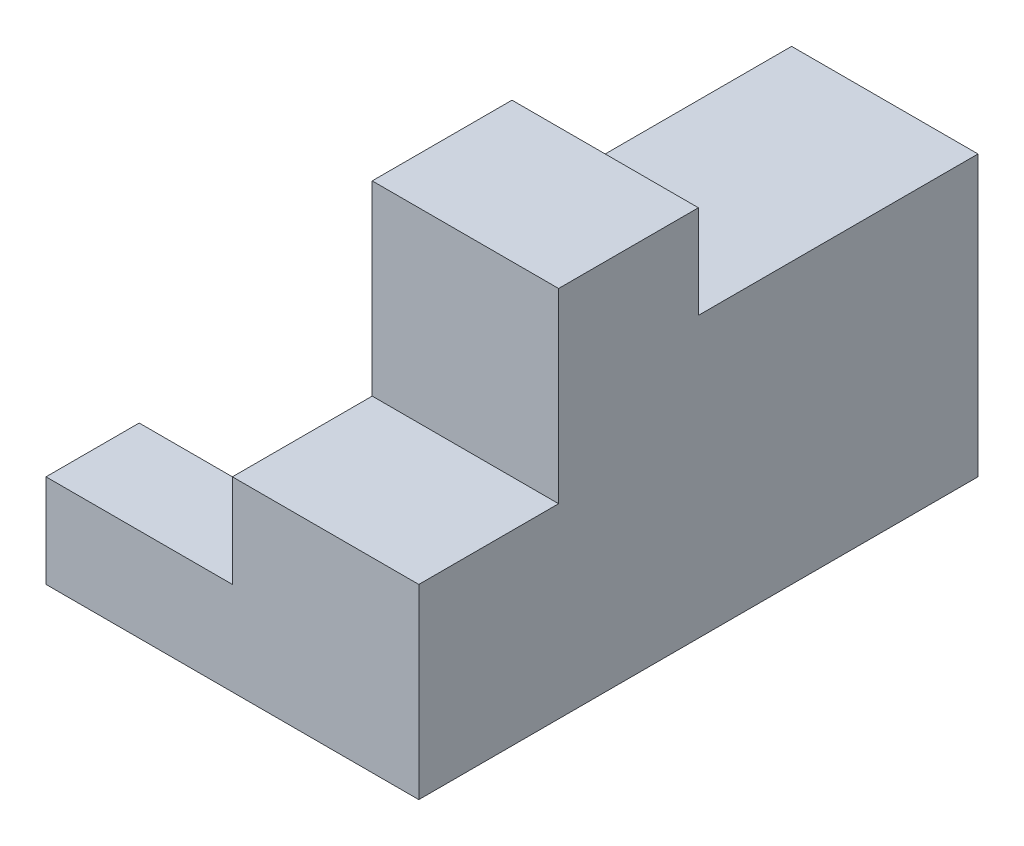
ISO-10303-21;
HEADER;
FILE_DESCRIPTION(('STEP AP214'),'2;1');
FILE_NAME('part.step','',(''),(''),'','','');
FILE_SCHEMA(('AUTOMOTIVE_DESIGN { 1 0 10303 214 1 1 1 1 }'));
ENDSEC;
DATA;
#1=APPLICATION_CONTEXT('core data for automotive mechanical design processes');
#2=APPLICATION_PROTOCOL_DEFINITION('international standard','automotive_design',2000,#1);
#3=PRODUCT_CONTEXT('',#1,'mechanical');
#4=PRODUCT('Part','Part','',(#3));
#5=PRODUCT_RELATED_PRODUCT_CATEGORY('part','',(#4));
#6=PRODUCT_DEFINITION_FORMATION('','',#4);
#7=PRODUCT_DEFINITION_CONTEXT('part definition',#1,'design');
#8=PRODUCT_DEFINITION('design','',#6,#7);
#9=PRODUCT_DEFINITION_SHAPE('','',#8);
#10=(LENGTH_UNIT() NAMED_UNIT(*) SI_UNIT(.MILLI.,.METRE.));
#11=(NAMED_UNIT(*) PLANE_ANGLE_UNIT() SI_UNIT($,.RADIAN.));
#12=(NAMED_UNIT(*) SI_UNIT($,.STERADIAN.) SOLID_ANGLE_UNIT());
#13=UNCERTAINTY_MEASURE_WITH_UNIT(LENGTH_MEASURE(1.E-05),#10,'distance_accuracy_value','');
#14=(GEOMETRIC_REPRESENTATION_CONTEXT(3) GLOBAL_UNCERTAINTY_ASSIGNED_CONTEXT((#13)) GLOBAL_UNIT_ASSIGNED_CONTEXT((#10,
#11,#12)) REPRESENTATION_CONTEXT('',''));
#15=CARTESIAN_POINT('',(0.,0.,0.));
#16=DIRECTION('',(0.,0.,1.));
#17=DIRECTION('',(1.,0.,0.));
#18=AXIS2_PLACEMENT_3D('',#15,#16,#17);
#19=CARTESIAN_POINT('',(0.,0.,60.));
#20=DIRECTION('',(0.,0.,-1.));
#21=DIRECTION('',(-1.,0.,0.));
#22=AXIS2_PLACEMENT_3D('',#19,#20,#21);
#23=PLANE('',#22);
#24=DIRECTION('',(1.,0.,0.));
#25=VECTOR('',#24,1.);
#26=CARTESIAN_POINT('',(40.,20.,60.));
#27=LINE('',#26,#25);
#28=CARTESIAN_POINT('',(20.,20.,60.));
#29=VERTEX_POINT('',#28);
#30=CARTESIAN_POINT('',(40.,20.,60.));
#31=VERTEX_POINT('',#30);
#32=EDGE_CURVE('E145',#29,#31,#27,.T.);
#33=ORIENTED_EDGE('',*,*,#32,.F.);
#34=DIRECTION('',(0.,1.,0.));
#35=VECTOR('',#34,1.);
#36=CARTESIAN_POINT('',(20.,10.,60.));
#37=LINE('',#36,#35);
#38=CARTESIAN_POINT('',(20.,10.,60.));
#39=VERTEX_POINT('',#38);
#40=EDGE_CURVE('E195',#39,#29,#37,.T.);
#41=ORIENTED_EDGE('',*,*,#40,.F.);
#42=DIRECTION('',(1.,0.,0.));
#43=VECTOR('',#42,1.);
#44=CARTESIAN_POINT('',(10.,10.,60.));
#45=LINE('',#44,#43);
#46=CARTESIAN_POINT('',(0.,10.,60.));
#47=VERTEX_POINT('',#46);
#48=EDGE_CURVE('E188',#47,#39,#45,.T.);
#49=ORIENTED_EDGE('',*,*,#48,.F.);
#50=DIRECTION('',(0.,-1.,0.));
#51=VECTOR('',#50,1.);
#52=CARTESIAN_POINT('',(0.,0.,60.));
#53=LINE('',#52,#51);
#54=CARTESIAN_POINT('',(0.,0.,60.));
#55=VERTEX_POINT('',#54);
#56=EDGE_CURVE('E224',#47,#55,#53,.T.);
#57=ORIENTED_EDGE('',*,*,#56,.T.);
#58=DIRECTION('',(1.,0.,0.));
#59=VECTOR('',#58,1.);
#60=CARTESIAN_POINT('',(0.,0.,60.));
#61=LINE('',#60,#59);
#62=CARTESIAN_POINT('',(40.,0.,60.));
#63=VERTEX_POINT('',#62);
#64=EDGE_CURVE('E226',#55,#63,#61,.T.);
#65=ORIENTED_EDGE('',*,*,#64,.T.);
#66=DIRECTION('',(0.,1.,0.));
#67=VECTOR('',#66,1.);
#68=CARTESIAN_POINT('',(40.,0.,60.));
#69=LINE('',#68,#67);
#70=EDGE_CURVE('E229',#63,#31,#69,.T.);
#71=ORIENTED_EDGE('',*,*,#70,.T.);
#72=EDGE_LOOP('',(#33,#41,#49,#57,#65,#71));
#73=FACE_BOUND('',#72,.T.);
#74=ADVANCED_FACE('F33',(#73),#23,.F.);
#75=CARTESIAN_POINT('',(0.,40.,60.));
#76=DIRECTION('',(0.,-1.,0.));
#77=DIRECTION('',(0.,0.,-1.));
#78=AXIS2_PLACEMENT_3D('',#75,#76,#77);
#79=PLANE('',#78);
#80=DIRECTION('',(0.,0.,-1.));
#81=VECTOR('',#80,1.);
#82=CARTESIAN_POINT('',(20.,40.,10.));
#83=LINE('',#82,#81);
#84=CARTESIAN_POINT('',(20.,40.,45.));
#85=VERTEX_POINT('',#84);
#86=CARTESIAN_POINT('',(20.,40.,30.));
#87=VERTEX_POINT('',#86);
#88=EDGE_CURVE('E184',#85,#87,#83,.T.);
#89=ORIENTED_EDGE('',*,*,#88,.F.);
#90=DIRECTION('',(-1.,0.,0.));
#91=VECTOR('',#90,1.);
#92=CARTESIAN_POINT('',(40.,40.,45.));
#93=LINE('',#92,#91);
#94=CARTESIAN_POINT('',(40.,40.,45.));
#95=VERTEX_POINT('',#94);
#96=EDGE_CURVE('E149',#95,#85,#93,.T.);
#97=ORIENTED_EDGE('',*,*,#96,.F.);
#98=DIRECTION('',(0.,0.,-1.));
#99=VECTOR('',#98,1.);
#100=CARTESIAN_POINT('',(40.,40.,60.));
#101=LINE('',#100,#99);
#102=CARTESIAN_POINT('',(40.,40.,30.));
#103=VERTEX_POINT('',#102);
#104=EDGE_CURVE('E154',#95,#103,#101,.T.);
#105=ORIENTED_EDGE('',*,*,#104,.T.);
#106=DIRECTION('',(1.,0.,0.));
#107=VECTOR('',#106,1.);
#108=CARTESIAN_POINT('',(40.,40.,30.));
#109=LINE('',#108,#107);
#110=EDGE_CURVE('E156',#87,#103,#109,.T.);
#111=ORIENTED_EDGE('',*,*,#110,.F.);
#112=EDGE_LOOP('',(#89,#97,#105,#111));
#113=FACE_BOUND('',#112,.T.);
#114=ADVANCED_FACE('F262',(#113),#79,.F.);
#115=CARTESIAN_POINT('',(10.,-20.,10.));
#116=DIRECTION('',(1.,0.,0.));
#117=DIRECTION('',(0.,0.,-1.));
#118=AXIS2_PLACEMENT_3D('',#115,#116,#117);
#119=PLANE('',#118);
#120=DIRECTION('',(0.,0.,1.));
#121=VECTOR('',#120,1.);
#122=CARTESIAN_POINT('',(10.,10.,10.));
#123=LINE('',#122,#121);
#124=CARTESIAN_POINT('',(10.,10.,10.));
#125=VERTEX_POINT('',#124);
#126=CARTESIAN_POINT('',(10.,10.,50.));
#127=VERTEX_POINT('',#126);
#128=EDGE_CURVE('E185',#125,#127,#123,.T.);
#129=ORIENTED_EDGE('',*,*,#128,.F.);
#130=DIRECTION('',(0.,1.,0.));
#131=VECTOR('',#130,1.);
#132=CARTESIAN_POINT('',(10.,-20.,10.));
#133=LINE('',#132,#131);
#134=CARTESIAN_POINT('',(10.,0.,10.));
#135=VERTEX_POINT('',#134);
#136=EDGE_CURVE('E200',#135,#125,#133,.T.);
#137=ORIENTED_EDGE('',*,*,#136,.F.);
#138=DIRECTION('',(0.,0.,-1.));
#139=VECTOR('',#138,1.);
#140=CARTESIAN_POINT('',(10.,0.,60.));
#141=LINE('',#140,#139);
#142=CARTESIAN_POINT('',(10.,0.,50.));
#143=VERTEX_POINT('',#142);
#144=EDGE_CURVE('E220',#143,#135,#141,.T.);
#145=ORIENTED_EDGE('',*,*,#144,.F.);
#146=DIRECTION('',(0.,1.,0.));
#147=VECTOR('',#146,1.);
#148=CARTESIAN_POINT('',(10.,-20.,50.));
#149=LINE('',#148,#147);
#150=EDGE_CURVE('E203',#143,#127,#149,.T.);
#151=ORIENTED_EDGE('',*,*,#150,.T.);
#152=EDGE_LOOP('',(#129,#137,#145,#151));
#153=FACE_BOUND('',#152,.T.);
#154=ADVANCED_FACE('F282',(#153),#119,.F.);
#155=CARTESIAN_POINT('',(0.,0.,60.));
#156=DIRECTION('',(1.,0.,0.));
#157=DIRECTION('',(0.,0.,-1.));
#158=AXIS2_PLACEMENT_3D('',#155,#156,#157);
#159=PLANE('',#158);
#160=ORIENTED_EDGE('',*,*,#56,.F.);
#161=DIRECTION('',(0.,0.,1.));
#162=VECTOR('',#161,1.);
#163=CARTESIAN_POINT('',(0.,10.,0.));
#164=LINE('',#163,#162);
#165=CARTESIAN_POINT('',(0.,10.,50.));
#166=VERTEX_POINT('',#165);
#167=EDGE_CURVE('E174',#166,#47,#164,.T.);
#168=ORIENTED_EDGE('',*,*,#167,.F.);
#169=DIRECTION('',(0.,1.,0.));
#170=VECTOR('',#169,1.);
#171=CARTESIAN_POINT('',(0.,-20.,50.));
#172=LINE('',#171,#170);
#173=CARTESIAN_POINT('',(0.,0.,50.));
#174=VERTEX_POINT('',#173);
#175=EDGE_CURVE('E207',#174,#166,#172,.T.);
#176=ORIENTED_EDGE('',*,*,#175,.F.);
#177=DIRECTION('',(0.,0.,-1.));
#178=VECTOR('',#177,1.);
#179=CARTESIAN_POINT('',(0.,0.,60.));
#180=LINE('',#179,#178);
#181=EDGE_CURVE('E11',#55,#174,#180,.T.);
#182=ORIENTED_EDGE('',*,*,#181,.F.);
#183=EDGE_LOOP('',(#160,#168,#176,#182));
#184=FACE_BOUND('',#183,.T.);
#185=ADVANCED_FACE('F275',(#184),#159,.F.);
#186=DIRECTION('',(0.,1.,0.));
#187=VECTOR('',#186,1.);
#188=CARTESIAN_POINT('',(0.,-20.,10.));
#189=LINE('',#188,#187);
#190=CARTESIAN_POINT('',(0.,0.,10.));
#191=VERTEX_POINT('',#190);
#192=CARTESIAN_POINT('',(0.,10.,10.));
#193=VERTEX_POINT('',#192);
#194=EDGE_CURVE('E210',#191,#193,#189,.T.);
#195=ORIENTED_EDGE('',*,*,#194,.T.);
#196=CARTESIAN_POINT('',(0.,10.,0.));
#197=VERTEX_POINT('',#196);
#198=EDGE_CURVE('E177',#197,#193,#164,.T.);
#199=ORIENTED_EDGE('',*,*,#198,.F.);
#200=DIRECTION('',(0.,-1.,0.));
#201=VECTOR('',#200,1.);
#202=CARTESIAN_POINT('',(0.,0.,0.));
#203=LINE('',#202,#201);
#204=CARTESIAN_POINT('',(0.,0.,0.));
#205=VERTEX_POINT('',#204);
#206=EDGE_CURVE('E223',#197,#205,#203,.T.);
#207=ORIENTED_EDGE('',*,*,#206,.T.);
#208=EDGE_CURVE('E41',#191,#205,#180,.T.);
#209=ORIENTED_EDGE('',*,*,#208,.F.);
#210=EDGE_LOOP('',(#195,#199,#207,#209));
#211=FACE_BOUND('',#210,.T.);
#212=ADVANCED_FACE('F35',(#211),#159,.F.);
#213=CARTESIAN_POINT('',(0.,0.,60.));
#214=DIRECTION('',(0.,1.,0.));
#215=DIRECTION('',(0.,0.,1.));
#216=AXIS2_PLACEMENT_3D('',#213,#214,#215);
#217=PLANE('',#216);
#218=ORIENTED_EDGE('',*,*,#181,.T.);
#219=DIRECTION('',(1.,0.,0.));
#220=VECTOR('',#219,1.);
#221=CARTESIAN_POINT('',(0.,0.,50.));
#222=LINE('',#221,#220);
#223=EDGE_CURVE('E217',#174,#143,#222,.T.);
#224=ORIENTED_EDGE('',*,*,#223,.T.);
#225=ORIENTED_EDGE('',*,*,#144,.T.);
#226=DIRECTION('',(-1.,0.,0.));
#227=VECTOR('',#226,1.);
#228=CARTESIAN_POINT('',(0.,0.,10.));
#229=LINE('',#228,#227);
#230=EDGE_CURVE('E206',#135,#191,#229,.T.);
#231=ORIENTED_EDGE('',*,*,#230,.T.);
#232=ORIENTED_EDGE('',*,*,#208,.T.);
#233=DIRECTION('',(1.,0.,0.));
#234=VECTOR('',#233,1.);
#235=CARTESIAN_POINT('',(0.,0.,0.));
#236=LINE('',#235,#234);
#237=CARTESIAN_POINT('',(40.,0.,0.));
#238=VERTEX_POINT('',#237);
#239=EDGE_CURVE('E232',#205,#238,#236,.T.);
#240=ORIENTED_EDGE('',*,*,#239,.T.);
#241=DIRECTION('',(0.,0.,-1.));
#242=VECTOR('',#241,1.);
#243=CARTESIAN_POINT('',(40.,0.,60.));
#244=LINE('',#243,#242);
#245=EDGE_CURVE('E236',#63,#238,#244,.T.);
#246=ORIENTED_EDGE('',*,*,#245,.F.);
#247=ORIENTED_EDGE('',*,*,#64,.F.);
#248=EDGE_LOOP('',(#218,#224,#225,#231,#232,#240,#246,#247));
#249=FACE_BOUND('',#248,.T.);
#250=ADVANCED_FACE('F244',(#249),#217,.F.);
#251=CARTESIAN_POINT('',(40.,0.,60.));
#252=DIRECTION('',(-1.,0.,0.));
#253=DIRECTION('',(0.,0.,1.));
#254=AXIS2_PLACEMENT_3D('',#251,#252,#253);
#255=PLANE('',#254);
#256=ORIENTED_EDGE('',*,*,#104,.F.);
#257=DIRECTION('',(0.,1.,0.));
#258=VECTOR('',#257,1.);
#259=CARTESIAN_POINT('',(40.,20.,45.));
#260=LINE('',#259,#258);
#261=CARTESIAN_POINT('',(40.,20.,45.));
#262=VERTEX_POINT('',#261);
#263=EDGE_CURVE('E134',#262,#95,#260,.T.);
#264=ORIENTED_EDGE('',*,*,#263,.F.);
#265=DIRECTION('',(0.,0.,-1.));
#266=VECTOR('',#265,1.);
#267=CARTESIAN_POINT('',(40.,20.,60.));
#268=LINE('',#267,#266);
#269=EDGE_CURVE('E140',#31,#262,#268,.T.);
#270=ORIENTED_EDGE('',*,*,#269,.F.);
#271=ORIENTED_EDGE('',*,*,#70,.F.);
#272=ORIENTED_EDGE('',*,*,#245,.T.);
#273=DIRECTION('',(0.,1.,0.));
#274=VECTOR('',#273,1.);
#275=CARTESIAN_POINT('',(40.,0.,0.));
#276=LINE('',#275,#274);
#277=CARTESIAN_POINT('',(40.,30.,0.));
#278=VERTEX_POINT('',#277);
#279=EDGE_CURVE('E227',#238,#278,#276,.T.);
#280=ORIENTED_EDGE('',*,*,#279,.T.);
#281=DIRECTION('',(0.,0.,-1.));
#282=VECTOR('',#281,1.);
#283=CARTESIAN_POINT('',(40.,30.,0.));
#284=LINE('',#283,#282);
#285=CARTESIAN_POINT('',(40.,30.,30.));
#286=VERTEX_POINT('',#285);
#287=EDGE_CURVE('E161',#286,#278,#284,.T.);
#288=ORIENTED_EDGE('',*,*,#287,.F.);
#289=DIRECTION('',(0.,1.,0.));
#290=VECTOR('',#289,1.);
#291=CARTESIAN_POINT('',(40.,30.,30.));
#292=LINE('',#291,#290);
#293=EDGE_CURVE('E172',#286,#103,#292,.T.);
#294=ORIENTED_EDGE('',*,*,#293,.T.);
#295=EDGE_LOOP('',(#256,#264,#270,#271,#272,#280,#288,#294));
#296=FACE_BOUND('',#295,.T.);
#297=ADVANCED_FACE('F152',(#296),#255,.F.);
#298=CARTESIAN_POINT('',(0.,0.,0.));
#299=DIRECTION('',(0.,0.,-1.));
#300=DIRECTION('',(-1.,0.,0.));
#301=AXIS2_PLACEMENT_3D('',#298,#299,#300);
#302=PLANE('',#301);
#303=DIRECTION('',(-1.,0.,0.));
#304=VECTOR('',#303,1.);
#305=CARTESIAN_POINT('',(40.,30.,0.));
#306=LINE('',#305,#304);
#307=CARTESIAN_POINT('',(20.,30.,0.));
#308=VERTEX_POINT('',#307);
#309=EDGE_CURVE('E56',#278,#308,#306,.T.);
#310=ORIENTED_EDGE('',*,*,#309,.F.);
#311=ORIENTED_EDGE('',*,*,#279,.F.);
#312=ORIENTED_EDGE('',*,*,#239,.F.);
#313=ORIENTED_EDGE('',*,*,#206,.F.);
#314=DIRECTION('',(-1.,0.,0.));
#315=VECTOR('',#314,1.);
#316=CARTESIAN_POINT('',(20.,10.,0.));
#317=LINE('',#316,#315);
#318=CARTESIAN_POINT('',(20.,10.,0.));
#319=VERTEX_POINT('',#318);
#320=EDGE_CURVE('E193',#319,#197,#317,.T.);
#321=ORIENTED_EDGE('',*,*,#320,.F.);
#322=DIRECTION('',(0.,1.,0.));
#323=VECTOR('',#322,1.);
#324=CARTESIAN_POINT('',(20.,10.,0.));
#325=LINE('',#324,#323);
#326=EDGE_CURVE('E197',#319,#308,#325,.T.);
#327=ORIENTED_EDGE('',*,*,#326,.T.);
#328=EDGE_LOOP('',(#310,#311,#312,#313,#321,#327));
#329=FACE_BOUND('',#328,.T.);
#330=ADVANCED_FACE('F248',(#329),#302,.T.);
#331=CARTESIAN_POINT('',(10.,-20.,50.));
#332=DIRECTION('',(0.,0.,1.));
#333=DIRECTION('',(1.,0.,0.));
#334=AXIS2_PLACEMENT_3D('',#331,#332,#333);
#335=PLANE('',#334);
#336=ORIENTED_EDGE('',*,*,#175,.T.);
#337=DIRECTION('',(1.,0.,0.));
#338=VECTOR('',#337,1.);
#339=CARTESIAN_POINT('',(10.,10.,50.));
#340=LINE('',#339,#338);
#341=EDGE_CURVE('E182',#166,#127,#340,.T.);
#342=ORIENTED_EDGE('',*,*,#341,.T.);
#343=ORIENTED_EDGE('',*,*,#150,.F.);
#344=ORIENTED_EDGE('',*,*,#223,.F.);
#345=EDGE_LOOP('',(#336,#342,#343,#344));
#346=FACE_BOUND('',#345,.T.);
#347=ADVANCED_FACE('F277',(#346),#335,.F.);
#348=CARTESIAN_POINT('',(0.,-20.,10.));
#349=DIRECTION('',(0.,0.,-1.));
#350=DIRECTION('',(-1.,0.,0.));
#351=AXIS2_PLACEMENT_3D('',#348,#349,#350);
#352=PLANE('',#351);
#353=ORIENTED_EDGE('',*,*,#136,.T.);
#354=DIRECTION('',(-1.,0.,0.));
#355=VECTOR('',#354,1.);
#356=CARTESIAN_POINT('',(0.,10.,10.));
#357=LINE('',#356,#355);
#358=EDGE_CURVE('E179',#125,#193,#357,.T.);
#359=ORIENTED_EDGE('',*,*,#358,.T.);
#360=ORIENTED_EDGE('',*,*,#194,.F.);
#361=ORIENTED_EDGE('',*,*,#230,.F.);
#362=EDGE_LOOP('',(#353,#359,#360,#361));
#363=FACE_BOUND('',#362,.T.);
#364=ADVANCED_FACE('F284',(#363),#352,.F.);
#365=CARTESIAN_POINT('',(20.,10.,10.));
#366=DIRECTION('',(1.,0.,0.));
#367=DIRECTION('',(0.,0.,-1.));
#368=AXIS2_PLACEMENT_3D('',#365,#366,#367);
#369=PLANE('',#368);
#370=DIRECTION('',(0.,0.,1.));
#371=VECTOR('',#370,1.);
#372=CARTESIAN_POINT('',(20.,20.,60.));
#373=LINE('',#372,#371);
#374=CARTESIAN_POINT('',(20.,20.,45.));
#375=VERTEX_POINT('',#374);
#376=EDGE_CURVE('E139',#375,#29,#373,.T.);
#377=ORIENTED_EDGE('',*,*,#376,.F.);
#378=DIRECTION('',(0.,1.,0.));
#379=VECTOR('',#378,1.);
#380=CARTESIAN_POINT('',(20.,20.,45.));
#381=LINE('',#380,#379);
#382=EDGE_CURVE('E137',#375,#85,#381,.T.);
#383=ORIENTED_EDGE('',*,*,#382,.T.);
#384=ORIENTED_EDGE('',*,*,#88,.T.);
#385=DIRECTION('',(0.,1.,0.));
#386=VECTOR('',#385,1.);
#387=CARTESIAN_POINT('',(20.,30.,30.));
#388=LINE('',#387,#386);
#389=CARTESIAN_POINT('',(20.,30.,30.));
#390=VERTEX_POINT('',#389);
#391=EDGE_CURVE('E169',#390,#87,#388,.T.);
#392=ORIENTED_EDGE('',*,*,#391,.F.);
#393=DIRECTION('',(0.,0.,1.));
#394=VECTOR('',#393,1.);
#395=CARTESIAN_POINT('',(20.,30.,0.));
#396=LINE('',#395,#394);
#397=EDGE_CURVE('E164',#308,#390,#396,.T.);
#398=ORIENTED_EDGE('',*,*,#397,.F.);
#399=ORIENTED_EDGE('',*,*,#326,.F.);
#400=DIRECTION('',(0.,0.,-1.));
#401=VECTOR('',#400,1.);
#402=CARTESIAN_POINT('',(20.,10.,10.));
#403=LINE('',#402,#401);
#404=EDGE_CURVE('E191',#39,#319,#403,.T.);
#405=ORIENTED_EDGE('',*,*,#404,.F.);
#406=ORIENTED_EDGE('',*,*,#40,.T.);
#407=EDGE_LOOP('',(#377,#383,#384,#392,#398,#399,#405,#406));
#408=FACE_BOUND('',#407,.T.);
#409=ADVANCED_FACE('F258',(#408),#369,.F.);
#410=CARTESIAN_POINT('',(0.,10.,0.));
#411=DIRECTION('',(0.,1.,0.));
#412=DIRECTION('',(0.,0.,1.));
#413=AXIS2_PLACEMENT_3D('',#410,#411,#412);
#414=PLANE('',#413);
#415=ORIENTED_EDGE('',*,*,#320,.T.);
#416=ORIENTED_EDGE('',*,*,#198,.T.);
#417=ORIENTED_EDGE('',*,*,#358,.F.);
#418=ORIENTED_EDGE('',*,*,#128,.T.);
#419=ORIENTED_EDGE('',*,*,#341,.F.);
#420=ORIENTED_EDGE('',*,*,#167,.T.);
#421=ORIENTED_EDGE('',*,*,#48,.T.);
#422=ORIENTED_EDGE('',*,*,#404,.T.);
#423=EDGE_LOOP('',(#415,#416,#417,#418,#419,#420,#421,#422));
#424=FACE_BOUND('',#423,.T.);
#425=ADVANCED_FACE('F268',(#424),#414,.T.);
#426=CARTESIAN_POINT('',(40.,30.,30.));
#427=DIRECTION('',(0.,0.,1.));
#428=DIRECTION('',(1.,0.,0.));
#429=AXIS2_PLACEMENT_3D('',#426,#427,#428);
#430=PLANE('',#429);
#431=ORIENTED_EDGE('',*,*,#110,.T.);
#432=ORIENTED_EDGE('',*,*,#293,.F.);
#433=DIRECTION('',(1.,0.,0.));
#434=VECTOR('',#433,1.);
#435=CARTESIAN_POINT('',(40.,30.,30.));
#436=LINE('',#435,#434);
#437=EDGE_CURVE('E166',#390,#286,#436,.T.);
#438=ORIENTED_EDGE('',*,*,#437,.F.);
#439=ORIENTED_EDGE('',*,*,#391,.T.);
#440=EDGE_LOOP('',(#431,#432,#438,#439));
#441=FACE_BOUND('',#440,.T.);
#442=ADVANCED_FACE('F255',(#441),#430,.F.);
#443=CARTESIAN_POINT('',(0.,30.,0.));
#444=DIRECTION('',(0.,-1.,0.));
#445=DIRECTION('',(0.,0.,-1.));
#446=AXIS2_PLACEMENT_3D('',#443,#444,#445);
#447=PLANE('',#446);
#448=ORIENTED_EDGE('',*,*,#287,.T.);
#449=ORIENTED_EDGE('',*,*,#309,.T.);
#450=ORIENTED_EDGE('',*,*,#397,.T.);
#451=ORIENTED_EDGE('',*,*,#437,.T.);
#452=EDGE_LOOP('',(#448,#449,#450,#451));
#453=FACE_BOUND('',#452,.T.);
#454=ADVANCED_FACE('F251',(#453),#447,.F.);
#455=CARTESIAN_POINT('',(40.,20.,45.));
#456=DIRECTION('',(0.,0.,-1.));
#457=DIRECTION('',(-1.,0.,0.));
#458=AXIS2_PLACEMENT_3D('',#455,#456,#457);
#459=PLANE('',#458);
#460=ORIENTED_EDGE('',*,*,#96,.T.);
#461=ORIENTED_EDGE('',*,*,#382,.F.);
#462=DIRECTION('',(-1.,0.,0.));
#463=VECTOR('',#462,1.);
#464=CARTESIAN_POINT('',(40.,20.,45.));
#465=LINE('',#464,#463);
#466=EDGE_CURVE('E48',#262,#375,#465,.T.);
#467=ORIENTED_EDGE('',*,*,#466,.F.);
#468=ORIENTED_EDGE('',*,*,#263,.T.);
#469=EDGE_LOOP('',(#460,#461,#467,#468));
#470=FACE_BOUND('',#469,.T.);
#471=ADVANCED_FACE('F132',(#470),#459,.F.);
#472=CARTESIAN_POINT('',(0.,20.,0.));
#473=DIRECTION('',(0.,1.,0.));
#474=DIRECTION('',(0.,0.,1.));
#475=AXIS2_PLACEMENT_3D('',#472,#473,#474);
#476=PLANE('',#475);
#477=ORIENTED_EDGE('',*,*,#269,.T.);
#478=ORIENTED_EDGE('',*,*,#466,.T.);
#479=ORIENTED_EDGE('',*,*,#376,.T.);
#480=ORIENTED_EDGE('',*,*,#32,.T.);
#481=EDGE_LOOP('',(#477,#478,#479,#480));
#482=FACE_BOUND('',#481,.T.);
#483=ADVANCED_FACE('F143',(#482),#476,.T.);
#484=CLOSED_SHELL('',(#74,#114,#154,#185,#212,#250,#297,#330,#347,#364,#409,#425,#442,#454,#471,#483));
#485=MANIFOLD_SOLID_BREP('B2',#484);
#486=ADVANCED_BREP_SHAPE_REPRESENTATION('',(#18,#485),#14);
#487=SHAPE_DEFINITION_REPRESENTATION(#9,#486);
ENDSEC;
END-ISO-10303-21;
